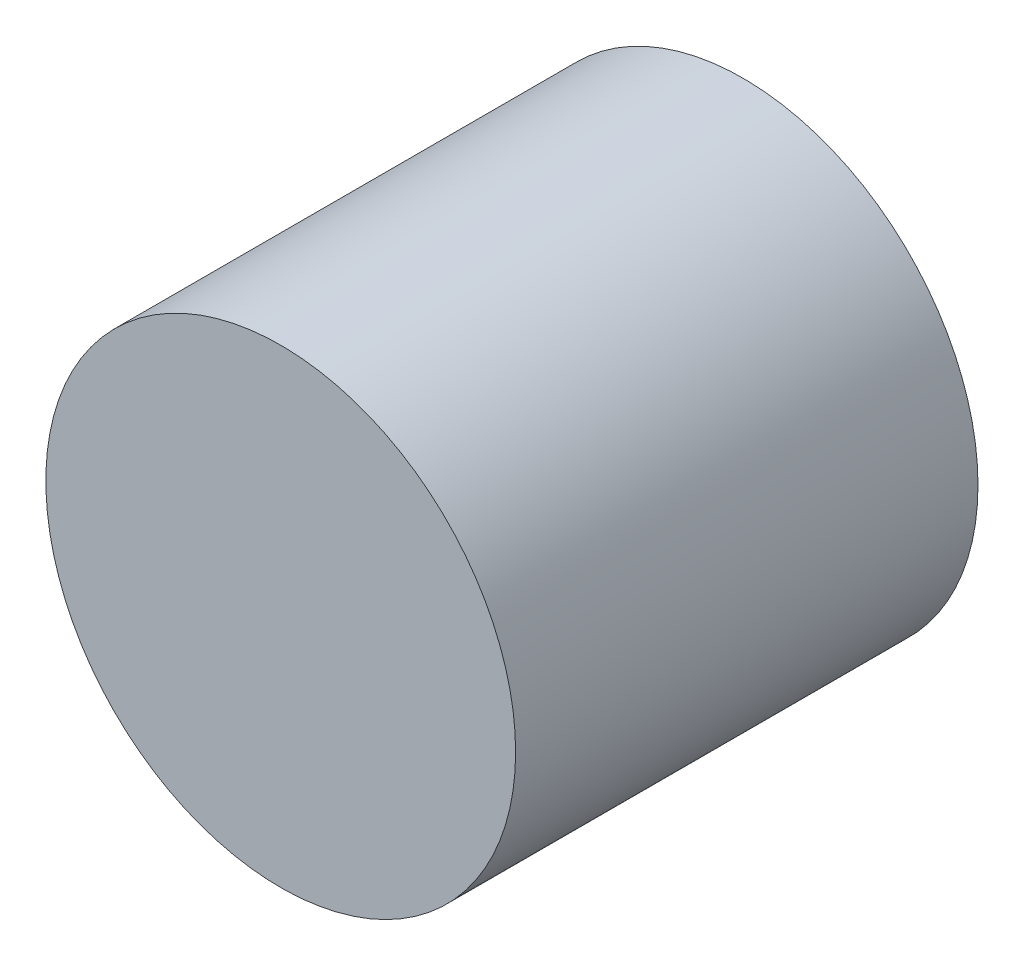
ISO-10303-21;
HEADER;
FILE_DESCRIPTION(('STEP AP214'),'2;1');
FILE_NAME('part.step','',(''),(''),'','','');
FILE_SCHEMA(('AUTOMOTIVE_DESIGN { 1 0 10303 214 1 1 1 1 }'));
ENDSEC;
DATA;
#1=APPLICATION_CONTEXT('core data for automotive mechanical design processes');
#2=APPLICATION_PROTOCOL_DEFINITION('international standard','automotive_design',2000,#1);
#3=PRODUCT_CONTEXT('',#1,'mechanical');
#4=PRODUCT('Part','Part','',(#3));
#5=PRODUCT_RELATED_PRODUCT_CATEGORY('part','',(#4));
#6=PRODUCT_DEFINITION_FORMATION('','',#4);
#7=PRODUCT_DEFINITION_CONTEXT('part definition',#1,'design');
#8=PRODUCT_DEFINITION('design','',#6,#7);
#9=PRODUCT_DEFINITION_SHAPE('','',#8);
#10=(LENGTH_UNIT() NAMED_UNIT(*) SI_UNIT(.MILLI.,.METRE.));
#11=(NAMED_UNIT(*) PLANE_ANGLE_UNIT() SI_UNIT($,.RADIAN.));
#12=(NAMED_UNIT(*) SI_UNIT($,.STERADIAN.) SOLID_ANGLE_UNIT());
#13=UNCERTAINTY_MEASURE_WITH_UNIT(LENGTH_MEASURE(1.E-05),#10,'distance_accuracy_value','');
#14=(GEOMETRIC_REPRESENTATION_CONTEXT(3) GLOBAL_UNCERTAINTY_ASSIGNED_CONTEXT((#13)) GLOBAL_UNIT_ASSIGNED_CONTEXT((#10,
#11,#12)) REPRESENTATION_CONTEXT('',''));
#15=CARTESIAN_POINT('',(0.,0.,0.));
#16=DIRECTION('',(0.,0.,1.));
#17=DIRECTION('',(1.,0.,0.));
#18=AXIS2_PLACEMENT_3D('',#15,#16,#17);
#19=CARTESIAN_POINT('',(0.,0.,100.));
#20=DIRECTION('',(0.,0.,-1.));
#21=DIRECTION('',(-1.,0.,0.));
#22=AXIS2_PLACEMENT_3D('',#19,#20,#21);
#23=CYLINDRICAL_SURFACE('',#22,50.8);
#24=CARTESIAN_POINT('',(0.,0.,100.));
#25=DIRECTION('',(0.,0.,1.));
#26=DIRECTION('',(1.,0.,0.));
#27=AXIS2_PLACEMENT_3D('',#24,#25,#26);
#28=CIRCLE('',#27,50.8);
#29=CARTESIAN_POINT('',(50.8,0.,100.));
#30=VERTEX_POINT('',#29);
#31=EDGE_CURVE('E10',#30,#30,#28,.T.);
#32=ORIENTED_EDGE('',*,*,#31,.F.);
#33=EDGE_LOOP('',(#32));
#34=FACE_BOUND('',#33,.T.);
#35=CARTESIAN_POINT('',(0.,0.,0.));
#36=DIRECTION('',(0.,0.,1.));
#37=DIRECTION('',(1.,0.,0.));
#38=AXIS2_PLACEMENT_3D('',#35,#36,#37);
#39=CIRCLE('',#38,50.8);
#40=CARTESIAN_POINT('',(50.8,0.,0.));
#41=VERTEX_POINT('',#40);
#42=EDGE_CURVE('E36',#41,#41,#39,.T.);
#43=ORIENTED_EDGE('',*,*,#42,.T.);
#44=EDGE_LOOP('',(#43));
#45=FACE_BOUND('',#44,.T.);
#46=ADVANCED_FACE('F33',(#34,#45),#23,.T.);
#47=CARTESIAN_POINT('',(0.,0.,100.));
#48=DIRECTION('',(0.,0.,1.));
#49=DIRECTION('',(1.,0.,0.));
#50=AXIS2_PLACEMENT_3D('',#47,#48,#49);
#51=PLANE('',#50);
#52=ORIENTED_EDGE('',*,*,#31,.T.);
#53=EDGE_LOOP('',(#52));
#54=FACE_BOUND('',#53,.T.);
#55=ADVANCED_FACE('F62',(#54),#51,.T.);
#56=CARTESIAN_POINT('',(0.,0.,0.));
#57=DIRECTION('',(0.,0.,1.));
#58=DIRECTION('',(1.,0.,0.));
#59=AXIS2_PLACEMENT_3D('',#56,#57,#58);
#60=PLANE('',#59);
#61=CARTESIAN_POINT('',(0.,0.,0.));
#62=DIRECTION('',(0.,0.,-1.));
#63=DIRECTION('',(-1.,0.,0.));
#64=AXIS2_PLACEMENT_3D('',#61,#62,#63);
#65=CIRCLE('',#64,49.8);
#66=CARTESIAN_POINT('',(-49.8,0.,0.));
#67=VERTEX_POINT('',#66);
#68=EDGE_CURVE('E45',#67,#67,#65,.T.);
#69=ORIENTED_EDGE('',*,*,#68,.F.);
#70=EDGE_LOOP('',(#69));
#71=FACE_BOUND('',#70,.T.);
#72=ORIENTED_EDGE('',*,*,#42,.F.);
#73=EDGE_LOOP('',(#72));
#74=FACE_BOUND('',#73,.T.);
#75=ADVANCED_FACE('F56',(#71,#74),#60,.F.);
#76=CARTESIAN_POINT('',(0.,0.,99.6));
#77=DIRECTION('',(0.,0.,-1.));
#78=DIRECTION('',(-1.,0.,0.));
#79=AXIS2_PLACEMENT_3D('',#76,#77,#78);
#80=CYLINDRICAL_SURFACE('',#79,49.8);
#81=CARTESIAN_POINT('',(0.,0.,99.6));
#82=DIRECTION('',(0.,0.,-1.));
#83=DIRECTION('',(-1.,0.,0.));
#84=AXIS2_PLACEMENT_3D('',#81,#82,#83);
#85=CIRCLE('',#84,49.8);
#86=CARTESIAN_POINT('',(-49.8,0.,99.6));
#87=VERTEX_POINT('',#86);
#88=EDGE_CURVE('E43',#87,#87,#85,.T.);
#89=ORIENTED_EDGE('',*,*,#88,.F.);
#90=EDGE_LOOP('',(#89));
#91=FACE_BOUND('',#90,.T.);
#92=ORIENTED_EDGE('',*,*,#68,.T.);
#93=EDGE_LOOP('',(#92));
#94=FACE_BOUND('',#93,.T.);
#95=ADVANCED_FACE('F53',(#91,#94),#80,.F.);
#96=CARTESIAN_POINT('',(0.,0.,99.6));
#97=DIRECTION('',(0.,0.,-1.));
#98=DIRECTION('',(-1.,0.,0.));
#99=AXIS2_PLACEMENT_3D('',#96,#97,#98);
#100=PLANE('',#99);
#101=ORIENTED_EDGE('',*,*,#88,.T.);
#102=EDGE_LOOP('',(#101));
#103=FACE_BOUND('',#102,.T.);
#104=ADVANCED_FACE('F51',(#103),#100,.T.);
#105=CLOSED_SHELL('',(#46,#55,#75,#95,#104));
#106=MANIFOLD_SOLID_BREP('B2',#105);
#107=ADVANCED_BREP_SHAPE_REPRESENTATION('',(#18,#106),#14);
#108=SHAPE_DEFINITION_REPRESENTATION(#9,#107);
ENDSEC;
END-ISO-10303-21;
